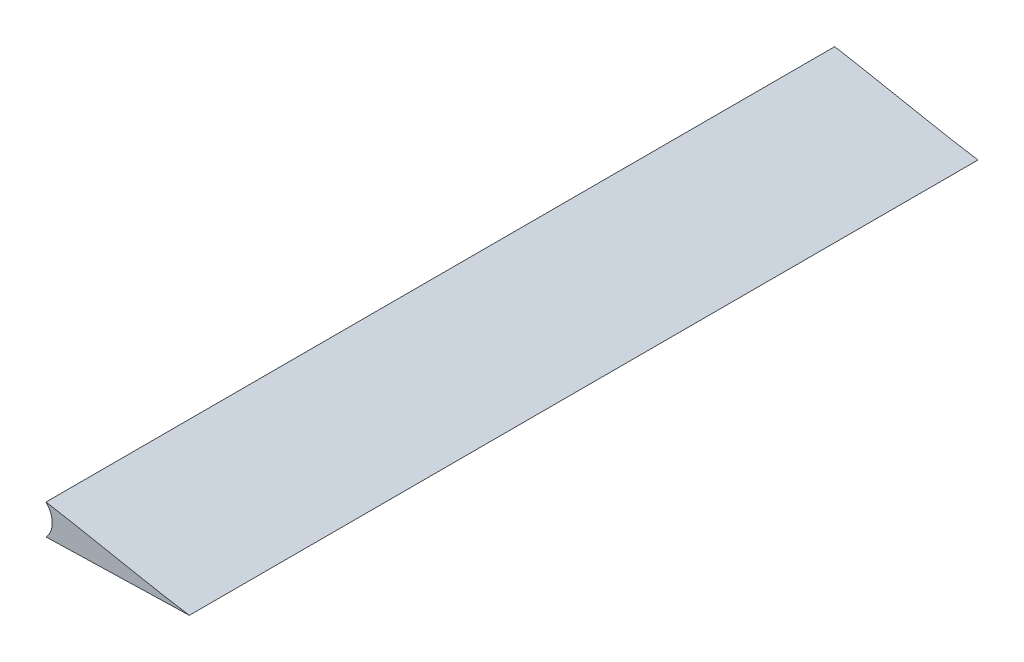
ISO-10303-21;
HEADER;
FILE_DESCRIPTION(('STEP AP214'),'2;1');
FILE_NAME('part.step','',(''),(''),'','','');
FILE_SCHEMA(('AUTOMOTIVE_DESIGN { 1 0 10303 214 1 1 1 1 }'));
ENDSEC;
DATA;
#1=APPLICATION_CONTEXT('core data for automotive mechanical design processes');
#2=APPLICATION_PROTOCOL_DEFINITION('international standard','automotive_design',2000,#1);
#3=PRODUCT_CONTEXT('',#1,'mechanical');
#4=PRODUCT('Part','Part','',(#3));
#5=PRODUCT_RELATED_PRODUCT_CATEGORY('part','',(#4));
#6=PRODUCT_DEFINITION_FORMATION('','',#4);
#7=PRODUCT_DEFINITION_CONTEXT('part definition',#1,'design');
#8=PRODUCT_DEFINITION('design','',#6,#7);
#9=PRODUCT_DEFINITION_SHAPE('','',#8);
#10=(LENGTH_UNIT() NAMED_UNIT(*) SI_UNIT(.MILLI.,.METRE.));
#11=(NAMED_UNIT(*) PLANE_ANGLE_UNIT() SI_UNIT($,.RADIAN.));
#12=(NAMED_UNIT(*) SI_UNIT($,.STERADIAN.) SOLID_ANGLE_UNIT());
#13=UNCERTAINTY_MEASURE_WITH_UNIT(LENGTH_MEASURE(1.E-05),#10,'distance_accuracy_value','');
#14=(GEOMETRIC_REPRESENTATION_CONTEXT(3) GLOBAL_UNCERTAINTY_ASSIGNED_CONTEXT((#13)) GLOBAL_UNIT_ASSIGNED_CONTEXT((#10,
#11,#12)) REPRESENTATION_CONTEXT('',''));
#15=CARTESIAN_POINT('',(0.,0.,0.));
#16=DIRECTION('',(0.,0.,1.));
#17=DIRECTION('',(1.,0.,0.));
#18=AXIS2_PLACEMENT_3D('',#15,#16,#17);
#19=CARTESIAN_POINT('',(100.918242869635,-5.70312155972156,875.));
#20=CARTESIAN_POINT('',(100.917928301793,-5.69198405836472,875.));
#21=CARTESIAN_POINT('',(100.10387255541,-5.62352228888477,875.));
#22=CARTESIAN_POINT('',(99.2805924787461,-5.46457437941949,875.));
#23=CARTESIAN_POINT('',(97.3018387610102,-5.16729318068841,875.));
#24=CARTESIAN_POINT('',(94.8937922035613,-4.74031320806905,875.));
#25=CARTESIAN_POINT('',(91.7634180326536,-4.19402072090437,875.));
#26=CARTESIAN_POINT('',(88.0757791314598,-3.52709242375945,875.));
#27=CARTESIAN_POINT('',(83.8258683203558,-2.7338398887422,875.));
#28=CARTESIAN_POINT('',(79.0746653904455,-1.82915983321444,875.));
#29=CARTESIAN_POINT('',(73.8682926545335,-0.815261424369521,875.));
#30=CARTESIAN_POINT('',(68.2575867578557,0.281496710181075,875.));
#31=CARTESIAN_POINT('',(62.2976992437029,1.44772435993441,875.));
#32=CARTESIAN_POINT('',(56.0406275155923,2.65954132518187,875.));
#33=CARTESIAN_POINT('',(49.5223044176383,3.86329842138598,875.));
#34=CARTESIAN_POINT('',(42.7761633390597,5.02418206260204,875.));
#35=CARTESIAN_POINT('',(35.8424652144832,6.15936269502018,875.));
#36=CARTESIAN_POINT('',(28.7548949857195,7.22523749141442,875.));
#37=CARTESIAN_POINT('',(21.5570881683195,8.21203636309571,875.));
#38=CARTESIAN_POINT('',(14.2899389211875,9.11702244002896,875.));
#39=CARTESIAN_POINT('',(6.98649158126674,9.89650210355032,875.));
#40=CARTESIAN_POINT('',(-0.31229146466516,10.5674397355271,875.));
#41=CARTESIAN_POINT('',(-7.57325093320835,11.1014525657359,875.));
#42=CARTESIAN_POINT('',(-14.7567884271768,11.4844721960287,875.));
#43=CARTESIAN_POINT('',(-21.8292142161482,11.7343249899717,875.));
#44=CARTESIAN_POINT('',(-28.7563545150705,11.8210091917914,875.));
#45=CARTESIAN_POINT('',(-35.5035223333169,11.7506173931394,875.));
#46=CARTESIAN_POINT('',(-42.0399272145928,11.5280996785659,875.));
#47=CARTESIAN_POINT('',(-48.3376180525475,11.1396685856208,875.));
#48=CARTESIAN_POINT('',(-54.368823590549,10.5993161188278,875.));
#49=CARTESIAN_POINT('',(-60.1078137628036,9.91606598300808,875.));
#50=CARTESIAN_POINT('',(-65.5246311998618,9.08284133402565,875.));
#51=CARTESIAN_POINT('',(-70.6007109713803,8.13358039825953,875.));
#52=CARTESIAN_POINT('',(-75.3121243874859,7.06030936022038,875.));
#53=CARTESIAN_POINT('',(-79.6390126776094,5.88240060478776,875.));
#54=CARTESIAN_POINT('',(-83.5657941936788,4.62059294729546,875.));
#55=CARTESIAN_POINT('',(-87.0745733985271,3.28647899388426,875.));
#56=CARTESIAN_POINT('',(-90.1552552216402,1.90843012274513,875.));
#57=CARTESIAN_POINT('',(-92.7947781002031,0.504611279427612,875.));
#58=CARTESIAN_POINT('',(-94.9830779234318,-0.904381490727133,875.));
#59=CARTESIAN_POINT('',(-96.7129189019401,-2.2701975801555,875.));
#60=CARTESIAN_POINT('',(-98.000485424671,-3.58079275915454,875.));
#61=CARTESIAN_POINT('',(-98.7619057356522,-4.7431958355309,875.));
#62=CARTESIAN_POINT('',(-99.2301090632581,-5.85819372427054,875.));
#63=CARTESIAN_POINT('',(-98.6060252918995,-6.87008215824494,875.));
#64=CARTESIAN_POINT('',(-97.444377041171,-7.5453305846849,875.));
#65=CARTESIAN_POINT('',(-95.7467090817251,-8.18861564790779,875.));
#66=CARTESIAN_POINT('',(-93.4448586660228,-8.65302005006277,875.));
#67=CARTESIAN_POINT('',(-90.5328491856375,-8.98180980569674,875.));
#68=CARTESIAN_POINT('',(-87.0127860582048,-9.24993802916623,875.));
#69=CARTESIAN_POINT('',(-82.9066310664121,-9.47123086211927,875.));
#70=CARTESIAN_POINT('',(-78.2402207744729,-9.5911083476405,875.));
#71=CARTESIAN_POINT('',(-73.047587860927,-9.70003593625301,875.));
#72=CARTESIAN_POINT('',(-67.364458993906,-9.72682521205635,875.));
#73=CARTESIAN_POINT('',(-61.2329456663301,-9.73559881849179,875.));
#74=CARTESIAN_POINT('',(-54.695580066044,-9.66397132949298,875.));
#75=CARTESIAN_POINT('',(-47.7878601670729,-9.57405054041112,875.));
#76=CARTESIAN_POINT('',(-40.5476604494291,-9.39990522549842,875.));
#77=CARTESIAN_POINT('',(-33.0149068418517,-9.22416889674421,875.));
#78=CARTESIAN_POINT('',(-25.241541211049,-9.02440552376383,875.));
#79=CARTESIAN_POINT('',(-17.2817921202236,-8.80197066728498,875.));
#80=CARTESIAN_POINT('',(-9.19412489466216,-8.57548457521884,875.));
#81=CARTESIAN_POINT('',(-1.03475350320872,-8.38960097567362,875.));
#82=CARTESIAN_POINT('',(7.13493172426889,-8.16391426134132,875.));
#83=CARTESIAN_POINT('',(15.2619153059295,-7.93721196551508,875.));
#84=CARTESIAN_POINT('',(23.2920199469726,-7.75326587738116,875.));
#85=CARTESIAN_POINT('',(31.1719891282351,-7.52041286471104,875.));
#86=CARTESIAN_POINT('',(38.8533388610302,-7.32032333842978,875.));
#87=CARTESIAN_POINT('',(46.282726983524,-7.15503997672915,875.));
#88=CARTESIAN_POINT('',(53.396722649005,-6.94282534524174,875.));
#89=CARTESIAN_POINT('',(60.1347643764967,-6.76442572644932,875.));
#90=CARTESIAN_POINT('',(66.4617978730972,-6.61076011362349,875.));
#91=CARTESIAN_POINT('',(72.370019545206,-6.44406791450927,875.));
#92=CARTESIAN_POINT('',(77.8516908370389,-6.30469387873606,875.));
#93=CARTESIAN_POINT('',(82.8702925290339,-6.18945193371191,875.));
#94=CARTESIAN_POINT('',(87.3729744895545,-6.07418455055627,875.));
#95=CARTESIAN_POINT('',(91.2866368972505,-5.94365740290611,875.));
#96=CARTESIAN_POINT('',(94.6105801016291,-5.86381881005005,875.));
#97=CARTESIAN_POINT('',(97.1585045394195,-5.8207005319733,875.));
#98=CARTESIAN_POINT('',(99.2314529908179,-5.73825639570641,875.));
#99=CARTESIAN_POINT('',(100.085997803177,-5.73399991417884,875.));
#100=CARTESIAN_POINT('',(100.918560501522,-5.71436754579513,875.));
#101=CARTESIAN_POINT('',(100.918242869635,-5.70312155972156,875.));
#102=B_SPLINE_CURVE_WITH_KNOTS('',3,(#19,#20,#21,#22,#23,#24,#25,#26,#27,#28,#29,#30,#31,#32,
#33,#34,#35,#36,#37,#38,#39,#40,#41,#42,#43,#44,#45,#46,#47,#48,#49,#50,#51,#52,#53,#54,#55,#56,
#57,#58,#59,#60,#61,#62,#63,#64,#65,#66,#67,#68,#69,#70,#71,#72,#73,#74,#75,#76,#77,#78,#79,#80,
#81,#82,#83,#84,#85,#86,#87,#88,#89,#90,#91,#92,#93,#94,#95,#96,#97,#98,#99,#100,#101),
.UNSPECIFIED.,.T.,.F.,(4,1,1,1,1,1,1,1,1,1,1,1,1,1,1,1,1,1,1,1,1,1,1,1,1,1,1,1,1,1,1,1,1,1,1,1,
1,1,1,1,1,1,1,1,1,1,1,1,1,1,1,1,1,1,1,1,1,1,1,1,1,1,1,1,1,1,1,1,1,1,1,1,1,1,1,1,1,1,1,1,4),(0.,
0.000950607256080683,0.00375650719066246,0.00831711830518814,0.0145215342884101,
0.0222932577146515,0.0315598243393391,0.0422207516758567,0.0541509547964426,0.0672310262306302,
0.0813310375166049,0.0963074228768398,0.112011952110719,0.128327294433554,0.145184499499575,
0.162487628976913,0.180135525061467,0.198033487871075,0.21605882858555,0.234134494923981,
0.252191782121554,0.270104077304323,0.287817033152811,0.305234681094631,0.32228444776858,
0.338896328665586,0.3549861088409,0.3705058476665,0.385416955636935,0.399632136124818,
0.413115968198781,0.425822529578469,0.437703697321329,0.448737409392791,0.458879724153294,
0.468105332962517,0.476404611912194,0.483748471478625,0.490133859938562,0.495557185945741,
0.500011534122997,0.503516098018531,0.506001285786605,0.508215361182165,0.511493606790907,
0.515843652138343,0.521547382532886,0.528754591564628,0.537448665030227,0.547575187866189,
0.559073789891025,0.571867409394551,0.585873248090889,0.600979910722737,0.617080267312518,
0.634081341136593,0.651920682144897,0.670483603160468,0.689642386701722,0.709259498553066,
0.729200940708723,0.749303287247489,0.769441295125621,0.789466277541535,0.809254099942275,
0.828669735918119,0.847597547600215,0.865914742719292,0.883466593841964,0.900078508925935,
0.915617835106359,0.930134997771401,0.943663107271565,0.956049855203852,0.967158864622839,
0.97685265729829,0.984995817128692,0.991471780599749,0.99618355316532,0.999040133363778,1.),.UNSPECIFIED.);
#103=DIRECTION('',(0.,0.,-1.));
#104=VECTOR('',#103,1.);
#105=SURFACE_OF_LINEAR_EXTRUSION('',#102,#104);
#106=DIRECTION('',(0.,0.,-1.));
#107=VECTOR('',#106,1.);
#108=CARTESIAN_POINT('',(44.3701269819732,-7.19395111063311,875.));
#109=LINE('',#108,#107);
#110=CARTESIAN_POINT('',(44.3701269819732,-7.19395111063311,835.9));
#111=VERTEX_POINT('',#110);
#112=CARTESIAN_POINT('',(44.3701269819732,-7.19395111063311,524.707472239184));
#113=VERTEX_POINT('',#112);
#114=EDGE_CURVE('E11',#111,#113,#109,.T.);
#115=ORIENTED_EDGE('',*,*,#114,.T.);
#116=CARTESIAN_POINT('',(100.918242869635,-5.70312155972156,524.707472239184));
#117=CARTESIAN_POINT('',(100.917928301793,-5.69198405836472,524.707472239184));
#118=CARTESIAN_POINT('',(100.10387255541,-5.62352228888477,524.707472239184));
#119=CARTESIAN_POINT('',(99.2805924787461,-5.46457437941949,524.707472239184));
#120=CARTESIAN_POINT('',(97.3018387610102,-5.16729318068841,524.707472239184));
#121=CARTESIAN_POINT('',(94.8937922035613,-4.74031320806905,524.707472239184));
#122=CARTESIAN_POINT('',(91.7634180326536,-4.19402072090437,524.707472239184));
#123=CARTESIAN_POINT('',(88.0757791314598,-3.52709242375945,524.707472239184));
#124=CARTESIAN_POINT('',(83.8258683203558,-2.7338398887422,524.707472239184));
#125=CARTESIAN_POINT('',(79.0746653904455,-1.82915983321444,524.707472239184));
#126=CARTESIAN_POINT('',(73.8682926545335,-0.815261424369521,524.707472239184));
#127=CARTESIAN_POINT('',(68.2575867578557,0.281496710181075,524.707472239184));
#128=CARTESIAN_POINT('',(62.2976992437029,1.44772435993441,524.707472239184));
#129=CARTESIAN_POINT('',(56.0406275155923,2.65954132518187,524.707472239184));
#130=CARTESIAN_POINT('',(49.5223044176383,3.86329842138598,524.707472239184));
#131=CARTESIAN_POINT('',(42.7761633390597,5.02418206260204,524.707472239184));
#132=CARTESIAN_POINT('',(35.8424652144832,6.15936269502018,524.707472239184));
#133=CARTESIAN_POINT('',(28.7548949857195,7.22523749141442,524.707472239184));
#134=CARTESIAN_POINT('',(21.5570881683195,8.21203636309571,524.707472239184));
#135=CARTESIAN_POINT('',(14.2899389211875,9.11702244002896,524.707472239184));
#136=CARTESIAN_POINT('',(6.98649158126674,9.89650210355032,524.707472239184));
#137=CARTESIAN_POINT('',(-0.31229146466516,10.5674397355271,524.707472239184));
#138=CARTESIAN_POINT('',(-7.57325093320835,11.1014525657359,524.707472239184));
#139=CARTESIAN_POINT('',(-14.7567884271768,11.4844721960287,524.707472239184));
#140=CARTESIAN_POINT('',(-21.8292142161482,11.7343249899717,524.707472239184));
#141=CARTESIAN_POINT('',(-28.7563545150705,11.8210091917914,524.707472239184));
#142=CARTESIAN_POINT('',(-35.5035223333169,11.7506173931394,524.707472239184));
#143=CARTESIAN_POINT('',(-42.0399272145928,11.5280996785659,524.707472239184));
#144=CARTESIAN_POINT('',(-48.3376180525475,11.1396685856208,524.707472239184));
#145=CARTESIAN_POINT('',(-54.368823590549,10.5993161188278,524.707472239184));
#146=CARTESIAN_POINT('',(-60.1078137628036,9.91606598300808,524.707472239184));
#147=CARTESIAN_POINT('',(-65.5246311998618,9.08284133402565,524.707472239184));
#148=CARTESIAN_POINT('',(-70.6007109713803,8.13358039825953,524.707472239184));
#149=CARTESIAN_POINT('',(-75.3121243874859,7.06030936022038,524.707472239184));
#150=CARTESIAN_POINT('',(-79.6390126776094,5.88240060478776,524.707472239184));
#151=CARTESIAN_POINT('',(-83.5657941936788,4.62059294729546,524.707472239184));
#152=CARTESIAN_POINT('',(-87.0745733985271,3.28647899388426,524.707472239184));
#153=CARTESIAN_POINT('',(-90.1552552216402,1.90843012274513,524.707472239184));
#154=CARTESIAN_POINT('',(-92.7947781002031,0.504611279427612,524.707472239184));
#155=CARTESIAN_POINT('',(-94.9830779234318,-0.904381490727133,524.707472239184));
#156=CARTESIAN_POINT('',(-96.7129189019401,-2.2701975801555,524.707472239184));
#157=CARTESIAN_POINT('',(-98.000485424671,-3.58079275915454,524.707472239184));
#158=CARTESIAN_POINT('',(-98.7619057356522,-4.7431958355309,524.707472239184));
#159=CARTESIAN_POINT('',(-99.2301090632581,-5.85819372427054,524.707472239184));
#160=CARTESIAN_POINT('',(-98.6060252918995,-6.87008215824494,524.707472239184));
#161=CARTESIAN_POINT('',(-97.444377041171,-7.5453305846849,524.707472239184));
#162=CARTESIAN_POINT('',(-95.7467090817251,-8.18861564790779,524.707472239184));
#163=CARTESIAN_POINT('',(-93.4448586660228,-8.65302005006277,524.707472239184));
#164=CARTESIAN_POINT('',(-90.5328491856375,-8.98180980569674,524.707472239184));
#165=CARTESIAN_POINT('',(-87.0127860582048,-9.24993802916623,524.707472239184));
#166=CARTESIAN_POINT('',(-82.9066310664121,-9.47123086211927,524.707472239184));
#167=CARTESIAN_POINT('',(-78.2402207744729,-9.5911083476405,524.707472239184));
#168=CARTESIAN_POINT('',(-73.047587860927,-9.70003593625301,524.707472239184));
#169=CARTESIAN_POINT('',(-67.364458993906,-9.72682521205635,524.707472239184));
#170=CARTESIAN_POINT('',(-61.2329456663301,-9.73559881849179,524.707472239184));
#171=CARTESIAN_POINT('',(-54.695580066044,-9.66397132949298,524.707472239184));
#172=CARTESIAN_POINT('',(-47.7878601670729,-9.57405054041112,524.707472239184));
#173=CARTESIAN_POINT('',(-40.5476604494291,-9.39990522549842,524.707472239184));
#174=CARTESIAN_POINT('',(-33.0149068418517,-9.22416889674421,524.707472239184));
#175=CARTESIAN_POINT('',(-25.241541211049,-9.02440552376383,524.707472239184));
#176=CARTESIAN_POINT('',(-17.2817921202236,-8.80197066728498,524.707472239184));
#177=CARTESIAN_POINT('',(-9.19412489466216,-8.57548457521884,524.707472239184));
#178=CARTESIAN_POINT('',(-1.03475350320872,-8.38960097567362,524.707472239184));
#179=CARTESIAN_POINT('',(7.13493172426889,-8.16391426134132,524.707472239184));
#180=CARTESIAN_POINT('',(15.2619153059295,-7.93721196551508,524.707472239184));
#181=CARTESIAN_POINT('',(23.2920199469726,-7.75326587738116,524.707472239184));
#182=CARTESIAN_POINT('',(31.1719891282351,-7.52041286471104,524.707472239184));
#183=CARTESIAN_POINT('',(38.8533388610302,-7.32032333842978,524.707472239184));
#184=CARTESIAN_POINT('',(46.282726983524,-7.15503997672915,524.707472239184));
#185=CARTESIAN_POINT('',(53.396722649005,-6.94282534524174,524.707472239184));
#186=CARTESIAN_POINT('',(60.1347643764967,-6.76442572644932,524.707472239184));
#187=CARTESIAN_POINT('',(66.4617978730972,-6.61076011362349,524.707472239184));
#188=CARTESIAN_POINT('',(72.370019545206,-6.44406791450927,524.707472239184));
#189=CARTESIAN_POINT('',(77.8516908370389,-6.30469387873606,524.707472239184));
#190=CARTESIAN_POINT('',(82.8702925290339,-6.18945193371191,524.707472239184));
#191=CARTESIAN_POINT('',(87.3729744895545,-6.07418455055627,524.707472239184));
#192=CARTESIAN_POINT('',(91.2866368972505,-5.94365740290611,524.707472239184));
#193=CARTESIAN_POINT('',(94.6105801016291,-5.86381881005005,524.707472239184));
#194=CARTESIAN_POINT('',(97.1585045394195,-5.8207005319733,524.707472239184));
#195=CARTESIAN_POINT('',(99.2314529908179,-5.73825639570641,524.707472239184));
#196=CARTESIAN_POINT('',(100.085997803177,-5.73399991417884,524.707472239184));
#197=CARTESIAN_POINT('',(100.918560501522,-5.71436754579513,524.707472239184));
#198=CARTESIAN_POINT('',(100.918242869635,-5.70312155972156,524.707472239184));
#199=B_SPLINE_CURVE_WITH_KNOTS('',3,(#116,#117,#118,#119,#120,#121,#122,#123,#124,#125,#126,
#127,#128,#129,#130,#131,#132,#133,#134,#135,#136,#137,#138,#139,#140,#141,#142,#143,#144,#145,
#146,#147,#148,#149,#150,#151,#152,#153,#154,#155,#156,#157,#158,#159,#160,#161,#162,#163,#164,
#165,#166,#167,#168,#169,#170,#171,#172,#173,#174,#175,#176,#177,#178,#179,#180,#181,#182,#183,
#184,#185,#186,#187,#188,#189,#190,#191,#192,#193,#194,#195,#196,#197,#198),.UNSPECIFIED.,.T.,
.F.,(4,1,1,1,1,1,1,1,1,1,1,1,1,1,1,1,1,1,1,1,1,1,1,1,1,1,1,1,1,1,1,1,1,1,1,1,1,1,1,1,1,1,1,1,1,
1,1,1,1,1,1,1,1,1,1,1,1,1,1,1,1,1,1,1,1,1,1,1,1,1,1,1,1,1,1,1,1,1,1,1,4),(0.,
0.000950607256080683,0.00375650719066246,0.00831711830518814,0.0145215342884101,
0.0222932577146515,0.0315598243393391,0.0422207516758567,0.0541509547964426,0.0672310262306302,
0.0813310375166049,0.0963074228768398,0.112011952110719,0.128327294433554,0.145184499499575,
0.162487628976913,0.180135525061467,0.198033487871075,0.21605882858555,0.234134494923981,
0.252191782121554,0.270104077304323,0.287817033152811,0.305234681094631,0.32228444776858,
0.338896328665586,0.3549861088409,0.3705058476665,0.385416955636935,0.399632136124818,
0.413115968198781,0.425822529578469,0.437703697321329,0.448737409392791,0.458879724153294,
0.468105332962517,0.476404611912194,0.483748471478625,0.490133859938562,0.495557185945741,
0.500011534122997,0.503516098018531,0.506001285786605,0.508215361182165,0.511493606790907,
0.515843652138343,0.521547382532886,0.528754591564628,0.537448665030227,0.547575187866189,
0.559073789891025,0.571867409394551,0.585873248090889,0.600979910722737,0.617080267312518,
0.634081341136593,0.651920682144897,0.670483603160468,0.689642386701722,0.709259498553066,
0.729200940708723,0.749303287247489,0.769441295125621,0.789466277541535,0.809254099942275,
0.828669735918119,0.847597547600215,0.865914742719292,0.883466593841964,0.900078508925935,
0.915617835106359,0.930134997771401,0.943663107271565,0.956049855203852,0.967158864622839,
0.97685265729829,0.984995817128692,0.991471780599749,0.99618355316532,0.999040133363778,1.),.UNSPECIFIED.);
#200=CARTESIAN_POINT('',(44.3701269819732,4.74542461704171,524.707472239184));
#201=VERTEX_POINT('',#200);
#202=EDGE_CURVE('E74',#113,#201,#199,.T.);
#203=ORIENTED_EDGE('',*,*,#202,.T.);
#204=DIRECTION('',(0.,0.,-1.));
#205=VECTOR('',#204,1.);
#206=CARTESIAN_POINT('',(44.3701269819732,4.74542461704171,875.));
#207=LINE('',#206,#205);
#208=CARTESIAN_POINT('',(44.3701269824866,4.74542461695446,835.9));
#209=VERTEX_POINT('',#208);
#210=EDGE_CURVE('E56',#201,#209,#207,.F.);
#211=ORIENTED_EDGE('',*,*,#210,.T.);
#212=CARTESIAN_POINT('',(100.918242869635,-5.70312155972156,835.9));
#213=CARTESIAN_POINT('',(100.917928301793,-5.69198405836472,835.9));
#214=CARTESIAN_POINT('',(100.10387255541,-5.62352228888477,835.9));
#215=CARTESIAN_POINT('',(99.2805924787461,-5.46457437941949,835.9));
#216=CARTESIAN_POINT('',(97.3018387610102,-5.16729318068841,835.9));
#217=CARTESIAN_POINT('',(94.8937922035613,-4.74031320806905,835.9));
#218=CARTESIAN_POINT('',(91.7634180326536,-4.19402072090437,835.9));
#219=CARTESIAN_POINT('',(88.0757791314598,-3.52709242375945,835.9));
#220=CARTESIAN_POINT('',(83.8258683203558,-2.7338398887422,835.9));
#221=CARTESIAN_POINT('',(79.0746653904455,-1.82915983321444,835.9));
#222=CARTESIAN_POINT('',(73.8682926545335,-0.815261424369521,835.9));
#223=CARTESIAN_POINT('',(68.2575867578557,0.281496710181075,835.9));
#224=CARTESIAN_POINT('',(62.2976992437029,1.44772435993441,835.9));
#225=CARTESIAN_POINT('',(56.0406275155923,2.65954132518187,835.9));
#226=CARTESIAN_POINT('',(49.5223044176383,3.86329842138598,835.9));
#227=CARTESIAN_POINT('',(42.7761633390597,5.02418206260204,835.9));
#228=CARTESIAN_POINT('',(35.8424652144832,6.15936269502018,835.9));
#229=CARTESIAN_POINT('',(28.7548949857195,7.22523749141442,835.9));
#230=CARTESIAN_POINT('',(21.5570881683195,8.21203636309571,835.9));
#231=CARTESIAN_POINT('',(14.2899389211875,9.11702244002896,835.9));
#232=CARTESIAN_POINT('',(6.98649158126674,9.89650210355032,835.9));
#233=CARTESIAN_POINT('',(-0.31229146466516,10.5674397355271,835.9));
#234=CARTESIAN_POINT('',(-7.57325093320835,11.1014525657359,835.9));
#235=CARTESIAN_POINT('',(-14.7567884271768,11.4844721960287,835.9));
#236=CARTESIAN_POINT('',(-21.8292142161482,11.7343249899717,835.9));
#237=CARTESIAN_POINT('',(-28.7563545150705,11.8210091917914,835.9));
#238=CARTESIAN_POINT('',(-35.5035223333169,11.7506173931394,835.9));
#239=CARTESIAN_POINT('',(-42.0399272145928,11.5280996785659,835.9));
#240=CARTESIAN_POINT('',(-48.3376180525475,11.1396685856208,835.9));
#241=CARTESIAN_POINT('',(-54.368823590549,10.5993161188278,835.9));
#242=CARTESIAN_POINT('',(-60.1078137628036,9.91606598300808,835.9));
#243=CARTESIAN_POINT('',(-65.5246311998618,9.08284133402565,835.9));
#244=CARTESIAN_POINT('',(-70.6007109713803,8.13358039825953,835.9));
#245=CARTESIAN_POINT('',(-75.3121243874859,7.06030936022038,835.9));
#246=CARTESIAN_POINT('',(-79.6390126776094,5.88240060478776,835.9));
#247=CARTESIAN_POINT('',(-83.5657941936788,4.62059294729546,835.9));
#248=CARTESIAN_POINT('',(-87.0745733985271,3.28647899388426,835.9));
#249=CARTESIAN_POINT('',(-90.1552552216402,1.90843012274513,835.9));
#250=CARTESIAN_POINT('',(-92.7947781002031,0.504611279427612,835.9));
#251=CARTESIAN_POINT('',(-94.9830779234318,-0.904381490727133,835.9));
#252=CARTESIAN_POINT('',(-96.7129189019401,-2.2701975801555,835.9));
#253=CARTESIAN_POINT('',(-98.000485424671,-3.58079275915454,835.9));
#254=CARTESIAN_POINT('',(-98.7619057356522,-4.7431958355309,835.9));
#255=CARTESIAN_POINT('',(-99.2301090632581,-5.85819372427054,835.9));
#256=CARTESIAN_POINT('',(-98.6060252918995,-6.87008215824494,835.9));
#257=CARTESIAN_POINT('',(-97.444377041171,-7.5453305846849,835.9));
#258=CARTESIAN_POINT('',(-95.7467090817251,-8.18861564790779,835.9));
#259=CARTESIAN_POINT('',(-93.4448586660228,-8.65302005006277,835.9));
#260=CARTESIAN_POINT('',(-90.5328491856375,-8.98180980569674,835.9));
#261=CARTESIAN_POINT('',(-87.0127860582048,-9.24993802916623,835.9));
#262=CARTESIAN_POINT('',(-82.9066310664121,-9.47123086211927,835.9));
#263=CARTESIAN_POINT('',(-78.2402207744729,-9.5911083476405,835.9));
#264=CARTESIAN_POINT('',(-73.047587860927,-9.70003593625301,835.9));
#265=CARTESIAN_POINT('',(-67.364458993906,-9.72682521205635,835.9));
#266=CARTESIAN_POINT('',(-61.2329456663301,-9.73559881849179,835.9));
#267=CARTESIAN_POINT('',(-54.695580066044,-9.66397132949298,835.9));
#268=CARTESIAN_POINT('',(-47.7878601670729,-9.57405054041112,835.9));
#269=CARTESIAN_POINT('',(-40.5476604494291,-9.39990522549842,835.9));
#270=CARTESIAN_POINT('',(-33.0149068418517,-9.22416889674421,835.9));
#271=CARTESIAN_POINT('',(-25.241541211049,-9.02440552376383,835.9));
#272=CARTESIAN_POINT('',(-17.2817921202236,-8.80197066728498,835.9));
#273=CARTESIAN_POINT('',(-9.19412489466216,-8.57548457521884,835.9));
#274=CARTESIAN_POINT('',(-1.03475350320872,-8.38960097567362,835.9));
#275=CARTESIAN_POINT('',(7.13493172426889,-8.16391426134132,835.9));
#276=CARTESIAN_POINT('',(15.2619153059295,-7.93721196551508,835.9));
#277=CARTESIAN_POINT('',(23.2920199469726,-7.75326587738116,835.9));
#278=CARTESIAN_POINT('',(31.1719891282351,-7.52041286471104,835.9));
#279=CARTESIAN_POINT('',(38.8533388610302,-7.32032333842978,835.9));
#280=CARTESIAN_POINT('',(46.282726983524,-7.15503997672915,835.9));
#281=CARTESIAN_POINT('',(53.396722649005,-6.94282534524174,835.9));
#282=CARTESIAN_POINT('',(60.1347643764967,-6.76442572644932,835.9));
#283=CARTESIAN_POINT('',(66.4617978730972,-6.61076011362349,835.9));
#284=CARTESIAN_POINT('',(72.370019545206,-6.44406791450927,835.9));
#285=CARTESIAN_POINT('',(77.8516908370389,-6.30469387873606,835.9));
#286=CARTESIAN_POINT('',(82.8702925290339,-6.18945193371191,835.9));
#287=CARTESIAN_POINT('',(87.3729744895545,-6.07418455055627,835.9));
#288=CARTESIAN_POINT('',(91.2866368972505,-5.94365740290611,835.9));
#289=CARTESIAN_POINT('',(94.6105801016291,-5.86381881005005,835.9));
#290=CARTESIAN_POINT('',(97.1585045394195,-5.8207005319733,835.9));
#291=CARTESIAN_POINT('',(99.2314529908179,-5.73825639570641,835.9));
#292=CARTESIAN_POINT('',(100.085997803177,-5.73399991417884,835.9));
#293=CARTESIAN_POINT('',(100.918560501522,-5.71436754579513,835.9));
#294=CARTESIAN_POINT('',(100.918242869635,-5.70312155972156,835.9));
#295=B_SPLINE_CURVE_WITH_KNOTS('',3,(#212,#213,#214,#215,#216,#217,#218,#219,#220,#221,#222,
#223,#224,#225,#226,#227,#228,#229,#230,#231,#232,#233,#234,#235,#236,#237,#238,#239,#240,#241,
#242,#243,#244,#245,#246,#247,#248,#249,#250,#251,#252,#253,#254,#255,#256,#257,#258,#259,#260,
#261,#262,#263,#264,#265,#266,#267,#268,#269,#270,#271,#272,#273,#274,#275,#276,#277,#278,#279,
#280,#281,#282,#283,#284,#285,#286,#287,#288,#289,#290,#291,#292,#293,#294),.UNSPECIFIED.,.T.,
.F.,(4,1,1,1,1,1,1,1,1,1,1,1,1,1,1,1,1,1,1,1,1,1,1,1,1,1,1,1,1,1,1,1,1,1,1,1,1,1,1,1,1,1,1,1,1,
1,1,1,1,1,1,1,1,1,1,1,1,1,1,1,1,1,1,1,1,1,1,1,1,1,1,1,1,1,1,1,1,1,1,1,4),(0.,
0.000950607256080683,0.00375650719066246,0.00831711830518814,0.0145215342884101,
0.0222932577146515,0.0315598243393391,0.0422207516758567,0.0541509547964426,0.0672310262306302,
0.0813310375166049,0.0963074228768398,0.112011952110719,0.128327294433554,0.145184499499575,
0.162487628976913,0.180135525061467,0.198033487871075,0.21605882858555,0.234134494923981,
0.252191782121554,0.270104077304323,0.287817033152811,0.305234681094631,0.32228444776858,
0.338896328665586,0.3549861088409,0.3705058476665,0.385416955636935,0.399632136124818,
0.413115968198781,0.425822529578469,0.437703697321329,0.448737409392791,0.458879724153294,
0.468105332962517,0.476404611912194,0.483748471478625,0.490133859938562,0.495557185945741,
0.500011534122997,0.503516098018531,0.506001285786605,0.508215361182165,0.511493606790907,
0.515843652138343,0.521547382532886,0.528754591564628,0.537448665030227,0.547575187866189,
0.559073789891025,0.571867409394551,0.585873248090889,0.600979910722737,0.617080267312518,
0.634081341136593,0.651920682144897,0.670483603160468,0.689642386701722,0.709259498553066,
0.729200940708723,0.749303287247489,0.769441295125621,0.789466277541535,0.809254099942275,
0.828669735918119,0.847597547600215,0.865914742719292,0.883466593841964,0.900078508925935,
0.915617835106359,0.930134997771401,0.943663107271565,0.956049855203852,0.967158864622839,
0.97685265729829,0.984995817128692,0.991471780599749,0.99618355316532,0.999040133363778,1.),.UNSPECIFIED.);
#296=CARTESIAN_POINT('',(100.918242869635,-5.70312155972156,835.9));
#297=VERTEX_POINT('',#296);
#298=EDGE_CURVE('E79',#209,#297,#295,.F.);
#299=ORIENTED_EDGE('',*,*,#298,.T.);
#300=DIRECTION('',(0.,1.,0.));
#301=VECTOR('',#300,1.);
#302=CARTESIAN_POINT('',(100.918243230552,-9.73559881849179,835.9));
#303=LINE('',#302,#301);
#304=CARTESIAN_POINT('',(100.918243230552,-5.70314710956909,835.9));
#305=VERTEX_POINT('',#304);
#306=EDGE_CURVE('E48',#305,#297,#303,.T.);
#307=ORIENTED_EDGE('',*,*,#306,.F.);
#308=EDGE_CURVE('E41',#305,#111,#295,.F.);
#309=ORIENTED_EDGE('',*,*,#308,.T.);
#310=EDGE_LOOP('',(#115,#203,#211,#299,#307,#309));
#311=FACE_BOUND('',#310,.T.);
#312=ADVANCED_FACE('F33',(#311),#105,.F.);
#313=CARTESIAN_POINT('',(100.918243230552,-9.73559881849179,835.9));
#314=DIRECTION('',(0.,0.,-1.));
#315=DIRECTION('',(-1.,0.,0.));
#316=AXIS2_PLACEMENT_3D('',#313,#314,#315);
#317=PLANE('',#316);
#318=ORIENTED_EDGE('',*,*,#298,.F.);
#319=CARTESIAN_POINT('',(38.4004391214573,-1.22426324658262,835.9));
#320=DIRECTION('',(0.,0.,1.));
#321=DIRECTION('',(-1.,0.,0.));
#322=AXIS2_PLACEMENT_3D('',#319,#320,#321);
#323=CIRCLE('',#322,8.44241353797495);
#324=EDGE_CURVE('E72',#111,#209,#323,.T.);
#325=ORIENTED_EDGE('',*,*,#324,.F.);
#326=ORIENTED_EDGE('',*,*,#308,.F.);
#327=ORIENTED_EDGE('',*,*,#306,.T.);
#328=EDGE_LOOP('',(#318,#325,#326,#327));
#329=FACE_BOUND('',#328,.T.);
#330=ADVANCED_FACE('F91',(#329),#317,.F.);
#331=CARTESIAN_POINT('',(100.918243230552,-9.73559881849179,524.707472239184));
#332=DIRECTION('',(0.,0.,1.));
#333=DIRECTION('',(1.,0.,0.));
#334=AXIS2_PLACEMENT_3D('',#331,#332,#333);
#335=PLANE('',#334);
#336=ORIENTED_EDGE('',*,*,#202,.F.);
#337=CARTESIAN_POINT('',(38.4004391214573,-1.22426324658262,524.707472239184));
#338=DIRECTION('',(0.,0.,1.));
#339=DIRECTION('',(-1.,0.,0.));
#340=AXIS2_PLACEMENT_3D('',#337,#338,#339);
#341=CIRCLE('',#340,8.44241353797495);
#342=EDGE_CURVE('E66',#113,#201,#341,.T.);
#343=ORIENTED_EDGE('',*,*,#342,.T.);
#344=EDGE_LOOP('',(#336,#343));
#345=FACE_BOUND('',#344,.T.);
#346=ADVANCED_FACE('F75',(#345),#335,.F.);
#347=CARTESIAN_POINT('',(38.4004391214573,-1.22426324658262,524.707472239184));
#348=DIRECTION('',(0.,0.,1.));
#349=DIRECTION('',(1.,0.,0.));
#350=AXIS2_PLACEMENT_3D('',#347,#348,#349);
#351=CYLINDRICAL_SURFACE('',#350,8.44241353797495);
#352=ORIENTED_EDGE('',*,*,#324,.T.);
#353=ORIENTED_EDGE('',*,*,#210,.F.);
#354=ORIENTED_EDGE('',*,*,#342,.F.);
#355=ORIENTED_EDGE('',*,*,#114,.F.);
#356=EDGE_LOOP('',(#352,#353,#354,#355));
#357=FACE_BOUND('',#356,.T.);
#358=ADVANCED_FACE('F68',(#357),#351,.F.);
#359=CLOSED_SHELL('',(#312,#330,#346,#358));
#360=MANIFOLD_SOLID_BREP('B2',#359);
#361=ADVANCED_BREP_SHAPE_REPRESENTATION('',(#18,#360),#14);
#362=SHAPE_DEFINITION_REPRESENTATION(#9,#361);
ENDSEC;
END-ISO-10303-21;
